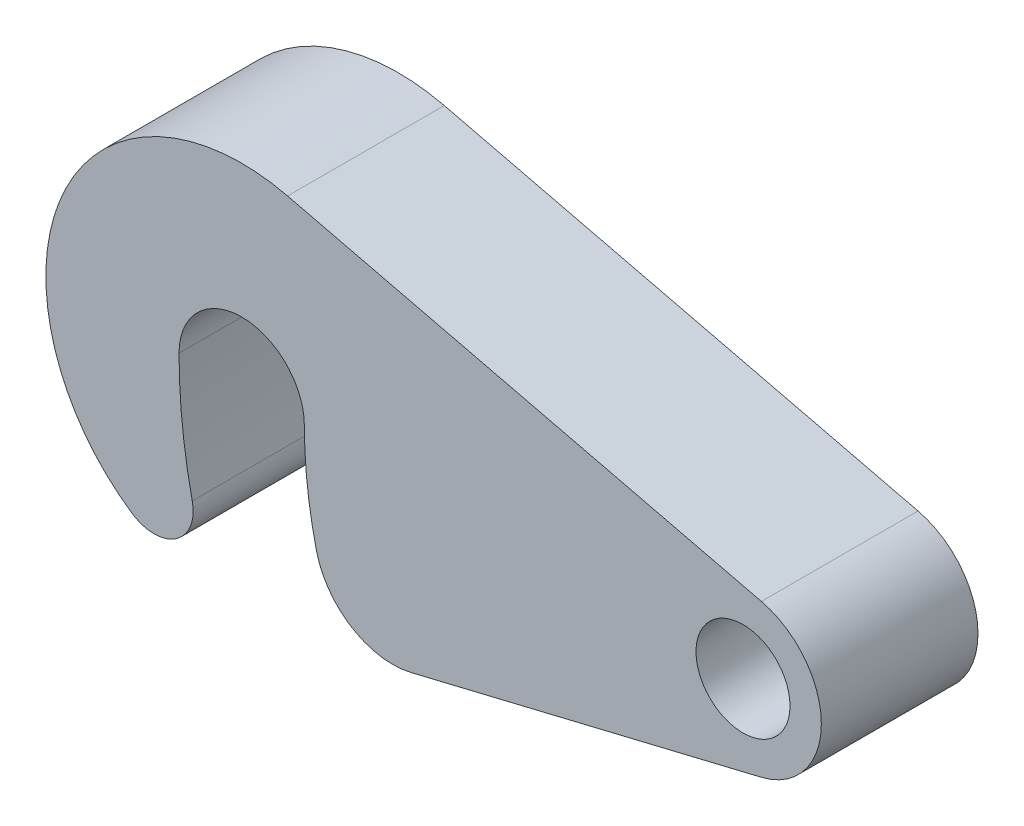
ISO-10303-21;
HEADER;
FILE_DESCRIPTION(('STEP AP214'),'2;1');
FILE_NAME('part.step','',(''),(''),'','','');
FILE_SCHEMA(('AUTOMOTIVE_DESIGN { 1 0 10303 214 1 1 1 1 }'));
ENDSEC;
DATA;
#1=APPLICATION_CONTEXT('core data for automotive mechanical design processes');
#2=APPLICATION_PROTOCOL_DEFINITION('international standard','automotive_design',2000,#1);
#3=PRODUCT_CONTEXT('',#1,'mechanical');
#4=PRODUCT('Part','Part','',(#3));
#5=PRODUCT_RELATED_PRODUCT_CATEGORY('part','',(#4));
#6=PRODUCT_DEFINITION_FORMATION('','',#4);
#7=PRODUCT_DEFINITION_CONTEXT('part definition',#1,'design');
#8=PRODUCT_DEFINITION('design','',#6,#7);
#9=PRODUCT_DEFINITION_SHAPE('','',#8);
#10=(LENGTH_UNIT() NAMED_UNIT(*) SI_UNIT(.MILLI.,.METRE.));
#11=(NAMED_UNIT(*) PLANE_ANGLE_UNIT() SI_UNIT($,.RADIAN.));
#12=(NAMED_UNIT(*) SI_UNIT($,.STERADIAN.) SOLID_ANGLE_UNIT());
#13=UNCERTAINTY_MEASURE_WITH_UNIT(LENGTH_MEASURE(1.E-05),#10,'distance_accuracy_value','');
#14=(GEOMETRIC_REPRESENTATION_CONTEXT(3) GLOBAL_UNCERTAINTY_ASSIGNED_CONTEXT((#13)) GLOBAL_UNIT_ASSIGNED_CONTEXT((#10,
#11,#12)) REPRESENTATION_CONTEXT('',''));
#15=CARTESIAN_POINT('',(0.,0.,0.));
#16=DIRECTION('',(0.,0.,1.));
#17=DIRECTION('',(1.,0.,0.));
#18=AXIS2_PLACEMENT_3D('',#15,#16,#17);
#19=CARTESIAN_POINT('',(64.,0.,10.));
#20=DIRECTION('',(0.,0.,1.));
#21=DIRECTION('',(1.,0.,0.));
#22=AXIS2_PLACEMENT_3D('',#19,#20,#21);
#23=PLANE('',#22);
#24=CARTESIAN_POINT('',(64.,0.,10.));
#25=DIRECTION('',(0.,0.,-1.));
#26=DIRECTION('',(1.,0.,0.));
#27=AXIS2_PLACEMENT_3D('',#24,#25,#26);
#28=CIRCLE('',#27,72.);
#29=CARTESIAN_POINT('',(-6.31250000000002,-15.4968494782003,10.));
#30=VERTEX_POINT('',#29);
#31=CARTESIAN_POINT('',(-8.,0.,10.));
#32=VERTEX_POINT('',#31);
#33=EDGE_CURVE('E153',#30,#32,#28,.T.);
#34=ORIENTED_EDGE('',*,*,#33,.T.);
#35=CARTESIAN_POINT('',(0.,0.,10.));
#36=DIRECTION('',(0.,0.,-1.));
#37=DIRECTION('',(1.,0.,0.));
#38=AXIS2_PLACEMENT_3D('',#35,#36,#37);
#39=CIRCLE('',#38,8.);
#40=CARTESIAN_POINT('',(8.,0.,10.));
#41=VERTEX_POINT('',#40);
#42=EDGE_CURVE('E96',#32,#41,#39,.T.);
#43=ORIENTED_EDGE('',*,*,#42,.T.);
#44=CARTESIAN_POINT('',(64.,0.,10.));
#45=DIRECTION('',(0.,0.,1.));
#46=DIRECTION('',(1.,0.,0.));
#47=AXIS2_PLACEMENT_3D('',#44,#45,#46);
#48=CIRCLE('',#47,56.);
#49=CARTESIAN_POINT('',(9.55980919394201,-13.125,10.));
#50=VERTEX_POINT('',#49);
#51=EDGE_CURVE('E171',#41,#50,#48,.T.);
#52=ORIENTED_EDGE('',*,*,#51,.T.);
#53=CARTESIAN_POINT('',(19.281271837881,-10.78125,10.));
#54=DIRECTION('',(0.,0.,1.));
#55=DIRECTION('',(1.,0.,0.));
#56=AXIS2_PLACEMENT_3D('',#53,#54,#55);
#57=CIRCLE('',#56,10.);
#58=CARTESIAN_POINT('',(21.625021837881,-20.5027126439389,10.));
#59=VERTEX_POINT('',#58);
#60=EDGE_CURVE('E188',#50,#59,#57,.T.);
#61=ORIENTED_EDGE('',*,*,#60,.T.);
#62=DIRECTION('',(0.972146264393893,0.234375,0.));
#63=VECTOR('',#62,1.);
#64=CARTESIAN_POINT('',(21.625021837881,-20.5027126439389,10.));
#65=LINE('',#64,#63);
#66=CARTESIAN_POINT('',(66.34375,-9.72146264393892,10.));
#67=VERTEX_POINT('',#66);
#68=EDGE_CURVE('E187',#59,#67,#65,.T.);
#69=ORIENTED_EDGE('',*,*,#68,.T.);
#70=CARTESIAN_POINT('',(64.,0.,10.));
#71=DIRECTION('',(0.,0.,1.));
#72=DIRECTION('',(1.,0.,0.));
#73=AXIS2_PLACEMENT_3D('',#70,#71,#72);
#74=CIRCLE('',#73,10.);
#75=CARTESIAN_POINT('',(66.34375,9.72146264393893,10.));
#76=VERTEX_POINT('',#75);
#77=EDGE_CURVE('E118',#67,#76,#74,.T.);
#78=ORIENTED_EDGE('',*,*,#77,.T.);
#79=DIRECTION('',(-0.972146264393893,0.234375,0.));
#80=VECTOR('',#79,1.);
#81=CARTESIAN_POINT('',(5.859375,24.3036566098473,10.));
#82=LINE('',#81,#80);
#83=CARTESIAN_POINT('',(5.859375,24.3036566098473,10.));
#84=VERTEX_POINT('',#83);
#85=EDGE_CURVE('E112',#76,#84,#82,.T.);
#86=ORIENTED_EDGE('',*,*,#85,.T.);
#87=CARTESIAN_POINT('',(0.,0.,10.));
#88=DIRECTION('',(0.,0.,1.));
#89=DIRECTION('',(1.,0.,0.));
#90=AXIS2_PLACEMENT_3D('',#87,#88,#89);
#91=CIRCLE('',#90,25.);
#92=CARTESIAN_POINT('',(-13.994140625,-20.7162744760664,10.));
#93=VERTEX_POINT('',#92);
#94=EDGE_CURVE('E116',#84,#93,#91,.T.);
#95=ORIENTED_EDGE('',*,*,#94,.T.);
#96=CARTESIAN_POINT('',(-11.1953125,-16.5730195808531,10.));
#97=DIRECTION('',(0.,0.,1.));
#98=DIRECTION('',(-1.,0.,0.));
#99=AXIS2_PLACEMENT_3D('',#96,#97,#98);
#100=CIRCLE('',#99,5.);
#101=EDGE_CURVE('E50',#93,#30,#100,.T.);
#102=ORIENTED_EDGE('',*,*,#101,.T.);
#103=EDGE_LOOP('',(#34,#43,#52,#61,#69,#78,#86,#95,#102));
#104=FACE_BOUND('',#103,.T.);
#105=CARTESIAN_POINT('',(64.,0.,10.));
#106=DIRECTION('',(0.,0.,1.));
#107=DIRECTION('',(1.,0.,0.));
#108=AXIS2_PLACEMENT_3D('',#105,#106,#107);
#109=CIRCLE('',#108,6.);
#110=CARTESIAN_POINT('',(70.,0.,10.));
#111=VERTEX_POINT('',#110);
#112=EDGE_CURVE('E140',#111,#111,#109,.T.);
#113=ORIENTED_EDGE('',*,*,#112,.F.);
#114=EDGE_LOOP('',(#113));
#115=FACE_BOUND('',#114,.T.);
#116=ADVANCED_FACE('F33',(#104,#115),#23,.T.);
#117=CARTESIAN_POINT('',(64.,0.,-10.));
#118=DIRECTION('',(0.,0.,1.));
#119=DIRECTION('',(1.,0.,0.));
#120=AXIS2_PLACEMENT_3D('',#117,#118,#119);
#121=PLANE('',#120);
#122=CARTESIAN_POINT('',(64.,0.,-10.));
#123=DIRECTION('',(0.,0.,-1.));
#124=DIRECTION('',(1.,0.,0.));
#125=AXIS2_PLACEMENT_3D('',#122,#123,#124);
#126=CIRCLE('',#125,72.);
#127=CARTESIAN_POINT('',(-6.31250000000002,-15.4968494782003,-10.));
#128=VERTEX_POINT('',#127);
#129=CARTESIAN_POINT('',(-8.,0.,-10.));
#130=VERTEX_POINT('',#129);
#131=EDGE_CURVE('E136',#128,#130,#126,.T.);
#132=ORIENTED_EDGE('',*,*,#131,.F.);
#133=CARTESIAN_POINT('',(-11.1953125,-16.5730195808531,-10.));
#134=DIRECTION('',(0.,0.,1.));
#135=DIRECTION('',(-1.,0.,0.));
#136=AXIS2_PLACEMENT_3D('',#133,#134,#135);
#137=CIRCLE('',#136,5.);
#138=CARTESIAN_POINT('',(-13.994140625,-20.7162744760664,-10.));
#139=VERTEX_POINT('',#138);
#140=EDGE_CURVE('E88',#139,#128,#137,.T.);
#141=ORIENTED_EDGE('',*,*,#140,.F.);
#142=CARTESIAN_POINT('',(0.,0.,-10.));
#143=DIRECTION('',(0.,0.,1.));
#144=DIRECTION('',(1.,0.,0.));
#145=AXIS2_PLACEMENT_3D('',#142,#143,#144);
#146=CIRCLE('',#145,25.);
#147=CARTESIAN_POINT('',(5.859375,24.3036566098473,-10.));
#148=VERTEX_POINT('',#147);
#149=EDGE_CURVE('E82',#148,#139,#146,.T.);
#150=ORIENTED_EDGE('',*,*,#149,.F.);
#151=DIRECTION('',(-0.972146264393893,0.234375,0.));
#152=VECTOR('',#151,1.);
#153=CARTESIAN_POINT('',(5.859375,24.3036566098473,-10.));
#154=LINE('',#153,#152);
#155=CARTESIAN_POINT('',(66.34375,9.72146264393893,-10.));
#156=VERTEX_POINT('',#155);
#157=EDGE_CURVE('E126',#156,#148,#154,.T.);
#158=ORIENTED_EDGE('',*,*,#157,.F.);
#159=CARTESIAN_POINT('',(64.,0.,-10.));
#160=DIRECTION('',(0.,0.,1.));
#161=DIRECTION('',(1.,0.,0.));
#162=AXIS2_PLACEMENT_3D('',#159,#160,#161);
#163=CIRCLE('',#162,10.);
#164=CARTESIAN_POINT('',(66.34375,-9.72146264393892,-10.));
#165=VERTEX_POINT('',#164);
#166=EDGE_CURVE('E148',#165,#156,#163,.T.);
#167=ORIENTED_EDGE('',*,*,#166,.F.);
#168=DIRECTION('',(0.972146264393893,0.234375,0.));
#169=VECTOR('',#168,1.);
#170=CARTESIAN_POINT('',(21.625021837881,-20.5027126439389,-10.));
#171=LINE('',#170,#169);
#172=CARTESIAN_POINT('',(21.625021837881,-20.5027126439389,-10.));
#173=VERTEX_POINT('',#172);
#174=EDGE_CURVE('E146',#173,#165,#171,.T.);
#175=ORIENTED_EDGE('',*,*,#174,.F.);
#176=CARTESIAN_POINT('',(19.281271837881,-10.78125,-10.));
#177=DIRECTION('',(0.,0.,1.));
#178=DIRECTION('',(1.,0.,0.));
#179=AXIS2_PLACEMENT_3D('',#176,#177,#178);
#180=CIRCLE('',#179,10.);
#181=CARTESIAN_POINT('',(9.55980919394201,-13.125,-10.));
#182=VERTEX_POINT('',#181);
#183=EDGE_CURVE('E144',#182,#173,#180,.T.);
#184=ORIENTED_EDGE('',*,*,#183,.F.);
#185=CARTESIAN_POINT('',(64.,0.,-10.));
#186=DIRECTION('',(0.,0.,1.));
#187=DIRECTION('',(1.,0.,0.));
#188=AXIS2_PLACEMENT_3D('',#185,#186,#187);
#189=CIRCLE('',#188,56.);
#190=CARTESIAN_POINT('',(8.,0.,-10.));
#191=VERTEX_POINT('',#190);
#192=EDGE_CURVE('E142',#191,#182,#189,.T.);
#193=ORIENTED_EDGE('',*,*,#192,.F.);
#194=CARTESIAN_POINT('',(0.,0.,-10.));
#195=DIRECTION('',(0.,0.,-1.));
#196=DIRECTION('',(1.,0.,0.));
#197=AXIS2_PLACEMENT_3D('',#194,#195,#196);
#198=CIRCLE('',#197,8.);
#199=EDGE_CURVE('E139',#130,#191,#198,.T.);
#200=ORIENTED_EDGE('',*,*,#199,.F.);
#201=EDGE_LOOP('',(#132,#141,#150,#158,#167,#175,#184,#193,#200));
#202=FACE_BOUND('',#201,.T.);
#203=CARTESIAN_POINT('',(64.,0.,-10.));
#204=DIRECTION('',(0.,0.,1.));
#205=DIRECTION('',(1.,0.,0.));
#206=AXIS2_PLACEMENT_3D('',#203,#204,#205);
#207=CIRCLE('',#206,6.);
#208=CARTESIAN_POINT('',(70.,0.,-10.));
#209=VERTEX_POINT('',#208);
#210=EDGE_CURVE('E195',#209,#209,#207,.T.);
#211=ORIENTED_EDGE('',*,*,#210,.T.);
#212=EDGE_LOOP('',(#211));
#213=FACE_BOUND('',#212,.T.);
#214=ADVANCED_FACE('F175',(#202,#213),#121,.F.);
#215=CARTESIAN_POINT('',(64.,0.,10.));
#216=DIRECTION('',(0.,0.,-1.));
#217=DIRECTION('',(-1.,0.,0.));
#218=AXIS2_PLACEMENT_3D('',#215,#216,#217);
#219=CYLINDRICAL_SURFACE('',#218,72.);
#220=ORIENTED_EDGE('',*,*,#131,.T.);
#221=DIRECTION('',(0.,0.,-1.));
#222=VECTOR('',#221,1.);
#223=CARTESIAN_POINT('',(-8.,0.,10.));
#224=LINE('',#223,#222);
#225=EDGE_CURVE('E11',#32,#130,#224,.T.);
#226=ORIENTED_EDGE('',*,*,#225,.F.);
#227=ORIENTED_EDGE('',*,*,#33,.F.);
#228=DIRECTION('',(0.,0.,-1.));
#229=VECTOR('',#228,1.);
#230=CARTESIAN_POINT('',(-6.31250000000002,-15.4968494782003,10.));
#231=LINE('',#230,#229);
#232=EDGE_CURVE('E132',#30,#128,#231,.T.);
#233=ORIENTED_EDGE('',*,*,#232,.T.);
#234=EDGE_LOOP('',(#220,#226,#227,#233));
#235=FACE_BOUND('',#234,.T.);
#236=ADVANCED_FACE('F35',(#235),#219,.F.);
#237=CARTESIAN_POINT('',(0.,0.,10.));
#238=DIRECTION('',(0.,0.,-1.));
#239=DIRECTION('',(-1.,0.,0.));
#240=AXIS2_PLACEMENT_3D('',#237,#238,#239);
#241=CYLINDRICAL_SURFACE('',#240,8.);
#242=ORIENTED_EDGE('',*,*,#199,.T.);
#243=DIRECTION('',(0.,0.,-1.));
#244=VECTOR('',#243,1.);
#245=CARTESIAN_POINT('',(8.,0.,10.));
#246=LINE('',#245,#244);
#247=EDGE_CURVE('E42',#41,#191,#246,.T.);
#248=ORIENTED_EDGE('',*,*,#247,.F.);
#249=ORIENTED_EDGE('',*,*,#42,.F.);
#250=ORIENTED_EDGE('',*,*,#225,.T.);
#251=EDGE_LOOP('',(#242,#248,#249,#250));
#252=FACE_BOUND('',#251,.T.);
#253=ADVANCED_FACE('F227',(#252),#241,.F.);
#254=CARTESIAN_POINT('',(64.,0.,10.));
#255=DIRECTION('',(0.,0.,-1.));
#256=DIRECTION('',(-1.,0.,0.));
#257=AXIS2_PLACEMENT_3D('',#254,#255,#256);
#258=CYLINDRICAL_SURFACE('',#257,56.);
#259=ORIENTED_EDGE('',*,*,#192,.T.);
#260=DIRECTION('',(0.,0.,-1.));
#261=VECTOR('',#260,1.);
#262=CARTESIAN_POINT('',(9.55980919394201,-13.125,10.));
#263=LINE('',#262,#261);
#264=EDGE_CURVE('E163',#50,#182,#263,.T.);
#265=ORIENTED_EDGE('',*,*,#264,.F.);
#266=ORIENTED_EDGE('',*,*,#51,.F.);
#267=ORIENTED_EDGE('',*,*,#247,.T.);
#268=EDGE_LOOP('',(#259,#265,#266,#267));
#269=FACE_BOUND('',#268,.T.);
#270=ADVANCED_FACE('F169',(#269),#258,.T.);
#271=CARTESIAN_POINT('',(19.281271837881,-10.78125,10.));
#272=DIRECTION('',(0.,0.,-1.));
#273=DIRECTION('',(-1.,0.,0.));
#274=AXIS2_PLACEMENT_3D('',#271,#272,#273);
#275=CYLINDRICAL_SURFACE('',#274,10.);
#276=ORIENTED_EDGE('',*,*,#183,.T.);
#277=DIRECTION('',(0.,0.,-1.));
#278=VECTOR('',#277,1.);
#279=CARTESIAN_POINT('',(21.625021837881,-20.5027126439389,10.));
#280=LINE('',#279,#278);
#281=EDGE_CURVE('E160',#59,#173,#280,.T.);
#282=ORIENTED_EDGE('',*,*,#281,.F.);
#283=ORIENTED_EDGE('',*,*,#60,.F.);
#284=ORIENTED_EDGE('',*,*,#264,.T.);
#285=EDGE_LOOP('',(#276,#282,#283,#284));
#286=FACE_BOUND('',#285,.T.);
#287=ADVANCED_FACE('F181',(#286),#275,.T.);
#288=CARTESIAN_POINT('',(21.625021837881,-20.5027126439389,10.));
#289=DIRECTION('',(-0.234375,0.972146264393893,0.));
#290=DIRECTION('',(-0.972146264393893,-0.234375,0.));
#291=AXIS2_PLACEMENT_3D('',#288,#289,#290);
#292=PLANE('',#291);
#293=ORIENTED_EDGE('',*,*,#174,.T.);
#294=DIRECTION('',(0.,0.,-1.));
#295=VECTOR('',#294,1.);
#296=CARTESIAN_POINT('',(66.34375,-9.72146264393892,10.));
#297=LINE('',#296,#295);
#298=EDGE_CURVE('E157',#67,#165,#297,.T.);
#299=ORIENTED_EDGE('',*,*,#298,.F.);
#300=ORIENTED_EDGE('',*,*,#68,.F.);
#301=ORIENTED_EDGE('',*,*,#281,.T.);
#302=EDGE_LOOP('',(#293,#299,#300,#301));
#303=FACE_BOUND('',#302,.T.);
#304=ADVANCED_FACE('F185',(#303),#292,.F.);
#305=CARTESIAN_POINT('',(64.,0.,10.));
#306=DIRECTION('',(0.,0.,-1.));
#307=DIRECTION('',(-1.,0.,0.));
#308=AXIS2_PLACEMENT_3D('',#305,#306,#307);
#309=CYLINDRICAL_SURFACE('',#308,10.);
#310=ORIENTED_EDGE('',*,*,#166,.T.);
#311=DIRECTION('',(0.,0.,-1.));
#312=VECTOR('',#311,1.);
#313=CARTESIAN_POINT('',(66.34375,9.72146264393893,10.));
#314=LINE('',#313,#312);
#315=EDGE_CURVE('E127',#76,#156,#314,.T.);
#316=ORIENTED_EDGE('',*,*,#315,.F.);
#317=ORIENTED_EDGE('',*,*,#77,.F.);
#318=ORIENTED_EDGE('',*,*,#298,.T.);
#319=EDGE_LOOP('',(#310,#316,#317,#318));
#320=FACE_BOUND('',#319,.T.);
#321=ADVANCED_FACE('F218',(#320),#309,.T.);
#322=CARTESIAN_POINT('',(5.859375,24.3036566098473,10.));
#323=DIRECTION('',(-0.234375,-0.972146264393893,0.));
#324=DIRECTION('',(0.972146264393893,-0.234375,0.));
#325=AXIS2_PLACEMENT_3D('',#322,#323,#324);
#326=PLANE('',#325);
#327=ORIENTED_EDGE('',*,*,#157,.T.);
#328=DIRECTION('',(0.,0.,-1.));
#329=VECTOR('',#328,1.);
#330=CARTESIAN_POINT('',(5.859375,24.3036566098473,10.));
#331=LINE('',#330,#329);
#332=EDGE_CURVE('E123',#84,#148,#331,.T.);
#333=ORIENTED_EDGE('',*,*,#332,.F.);
#334=ORIENTED_EDGE('',*,*,#85,.F.);
#335=ORIENTED_EDGE('',*,*,#315,.T.);
#336=EDGE_LOOP('',(#327,#333,#334,#335));
#337=FACE_BOUND('',#336,.T.);
#338=ADVANCED_FACE('F124',(#337),#326,.F.);
#339=CARTESIAN_POINT('',(0.,0.,10.));
#340=DIRECTION('',(0.,0.,-1.));
#341=DIRECTION('',(-1.,0.,0.));
#342=AXIS2_PLACEMENT_3D('',#339,#340,#341);
#343=CYLINDRICAL_SURFACE('',#342,25.);
#344=ORIENTED_EDGE('',*,*,#149,.T.);
#345=DIRECTION('',(0.,0.,-1.));
#346=VECTOR('',#345,1.);
#347=CARTESIAN_POINT('',(-13.994140625,-20.7162744760664,10.));
#348=LINE('',#347,#346);
#349=EDGE_CURVE('E128',#93,#139,#348,.T.);
#350=ORIENTED_EDGE('',*,*,#349,.F.);
#351=ORIENTED_EDGE('',*,*,#94,.F.);
#352=ORIENTED_EDGE('',*,*,#332,.T.);
#353=EDGE_LOOP('',(#344,#350,#351,#352));
#354=FACE_BOUND('',#353,.T.);
#355=ADVANCED_FACE('F130',(#354),#343,.T.);
#356=CARTESIAN_POINT('',(-11.1953125,-16.5730195808531,10.));
#357=DIRECTION('',(0.,0.,-1.));
#358=DIRECTION('',(-1.,0.,0.));
#359=AXIS2_PLACEMENT_3D('',#356,#357,#358);
#360=CYLINDRICAL_SURFACE('',#359,5.);
#361=ORIENTED_EDGE('',*,*,#140,.T.);
#362=ORIENTED_EDGE('',*,*,#232,.F.);
#363=ORIENTED_EDGE('',*,*,#101,.F.);
#364=ORIENTED_EDGE('',*,*,#349,.T.);
#365=EDGE_LOOP('',(#361,#362,#363,#364));
#366=FACE_BOUND('',#365,.T.);
#367=ADVANCED_FACE('F211',(#366),#360,.T.);
#368=CARTESIAN_POINT('',(64.,0.,10.));
#369=DIRECTION('',(0.,0.,-1.));
#370=DIRECTION('',(-1.,0.,0.));
#371=AXIS2_PLACEMENT_3D('',#368,#369,#370);
#372=CYLINDRICAL_SURFACE('',#371,6.);
#373=ORIENTED_EDGE('',*,*,#112,.T.);
#374=EDGE_LOOP('',(#373));
#375=FACE_BOUND('',#374,.T.);
#376=ORIENTED_EDGE('',*,*,#210,.F.);
#377=EDGE_LOOP('',(#376));
#378=FACE_BOUND('',#377,.T.);
#379=ADVANCED_FACE('F201',(#375,#378),#372,.F.);
#380=CLOSED_SHELL('',(#116,#214,#236,#253,#270,#287,#304,#321,#338,#355,#367,#379));
#381=MANIFOLD_SOLID_BREP('B2',#380);
#382=ADVANCED_BREP_SHAPE_REPRESENTATION('',(#18,#381),#14);
#383=SHAPE_DEFINITION_REPRESENTATION(#9,#382);
ENDSEC;
END-ISO-10303-21;
